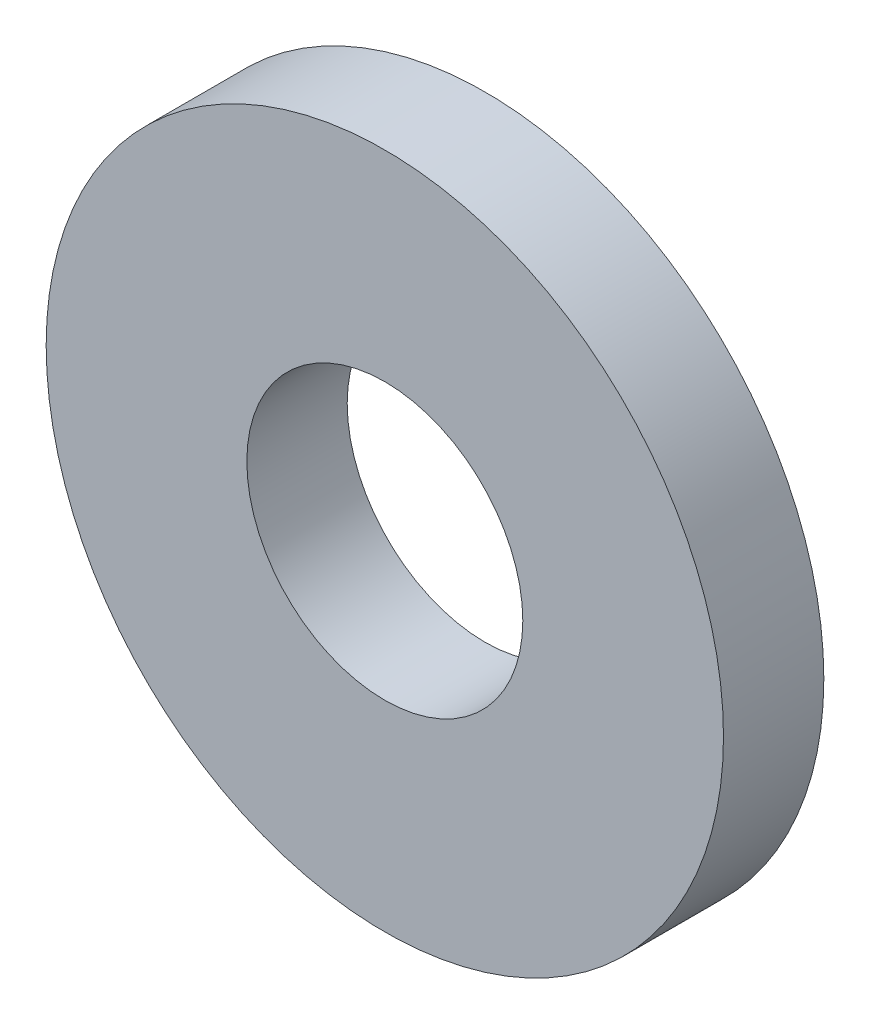
ISO-10303-21;
HEADER;
FILE_DESCRIPTION(('STEP AP214'),'2;1');
FILE_NAME('part.step','',(''),(''),'','','');
FILE_SCHEMA(('AUTOMOTIVE_DESIGN { 1 0 10303 214 1 1 1 1 }'));
ENDSEC;
DATA;
#1=APPLICATION_CONTEXT('core data for automotive mechanical design processes');
#2=APPLICATION_PROTOCOL_DEFINITION('international standard','automotive_design',2000,#1);
#3=PRODUCT_CONTEXT('',#1,'mechanical');
#4=PRODUCT('Part','Part','',(#3));
#5=PRODUCT_RELATED_PRODUCT_CATEGORY('part','',(#4));
#6=PRODUCT_DEFINITION_FORMATION('','',#4);
#7=PRODUCT_DEFINITION_CONTEXT('part definition',#1,'design');
#8=PRODUCT_DEFINITION('design','',#6,#7);
#9=PRODUCT_DEFINITION_SHAPE('','',#8);
#10=(LENGTH_UNIT() NAMED_UNIT(*) SI_UNIT(.MILLI.,.METRE.));
#11=(NAMED_UNIT(*) PLANE_ANGLE_UNIT() SI_UNIT($,.RADIAN.));
#12=(NAMED_UNIT(*) SI_UNIT($,.STERADIAN.) SOLID_ANGLE_UNIT());
#13=UNCERTAINTY_MEASURE_WITH_UNIT(LENGTH_MEASURE(1.E-05),#10,'distance_accuracy_value','');
#14=(GEOMETRIC_REPRESENTATION_CONTEXT(3) GLOBAL_UNCERTAINTY_ASSIGNED_CONTEXT((#13)) GLOBAL_UNIT_ASSIGNED_CONTEXT((#10,
#11,#12)) REPRESENTATION_CONTEXT('',''));
#15=CARTESIAN_POINT('',(0.,0.,0.));
#16=DIRECTION('',(0.,0.,1.));
#17=DIRECTION('',(1.,0.,0.));
#18=AXIS2_PLACEMENT_3D('',#15,#16,#17);
#19=CARTESIAN_POINT('',(0.,0.,3.99999999999997));
#20=DIRECTION('',(0.,0.,1.00000000000003));
#21=DIRECTION('',(0.999999999999999,0.,0.));
#22=AXIS2_PLACEMENT_3D('',#19,#20,#21);
#23=PLANE('',#22);
#24=CARTESIAN_POINT('',(0.,0.,3.99999999999997));
#25=DIRECTION('',(0.,0.,1.00000000000003));
#26=DIRECTION('',(0.999999999999999,0.,0.));
#27=AXIS2_PLACEMENT_3D('',#24,#25,#26);
#28=CIRCLE('',#27,13.5);
#29=CARTESIAN_POINT('',(13.5,0.,3.99999999999997));
#30=VERTEX_POINT('',#29);
#31=EDGE_CURVE('E10',#30,#30,#28,.T.);
#32=ORIENTED_EDGE('',*,*,#31,.T.);
#33=EDGE_LOOP('',(#32));
#34=FACE_BOUND('',#33,.T.);
#35=CARTESIAN_POINT('',(0.,0.,3.99999999999997));
#36=DIRECTION('',(0.,0.,1.00000000000003));
#37=DIRECTION('',(0.999999999999999,0.,0.));
#38=AXIS2_PLACEMENT_3D('',#35,#36,#37);
#39=CIRCLE('',#38,5.5);
#40=CARTESIAN_POINT('',(5.49999999999999,0.,3.99999999999997));
#41=VERTEX_POINT('',#40);
#42=EDGE_CURVE('E41',#41,#41,#39,.T.);
#43=ORIENTED_EDGE('',*,*,#42,.F.);
#44=EDGE_LOOP('',(#43));
#45=FACE_BOUND('',#44,.T.);
#46=ADVANCED_FACE('F30',(#34,#45),#23,.T.);
#47=CARTESIAN_POINT('',(0.,0.,0.));
#48=DIRECTION('',(0.,0.,1.00000000000003));
#49=DIRECTION('',(0.999999999999999,0.,0.));
#50=AXIS2_PLACEMENT_3D('',#47,#48,#49);
#51=PLANE('',#50);
#52=CARTESIAN_POINT('',(0.,0.,0.));
#53=DIRECTION('',(0.,0.,1.00000000000003));
#54=DIRECTION('',(0.999999999999999,0.,0.));
#55=AXIS2_PLACEMENT_3D('',#52,#53,#54);
#56=CIRCLE('',#55,13.5);
#57=CARTESIAN_POINT('',(13.5,0.,0.));
#58=VERTEX_POINT('',#57);
#59=EDGE_CURVE('E34',#58,#58,#56,.T.);
#60=ORIENTED_EDGE('',*,*,#59,.F.);
#61=EDGE_LOOP('',(#60));
#62=FACE_BOUND('',#61,.T.);
#63=CARTESIAN_POINT('',(0.,0.,0.));
#64=DIRECTION('',(0.,0.,1.00000000000003));
#65=DIRECTION('',(0.999999999999999,0.,0.));
#66=AXIS2_PLACEMENT_3D('',#63,#64,#65);
#67=CIRCLE('',#66,5.5);
#68=CARTESIAN_POINT('',(5.49999999999999,0.,0.));
#69=VERTEX_POINT('',#68);
#70=EDGE_CURVE('E43',#69,#69,#67,.T.);
#71=ORIENTED_EDGE('',*,*,#70,.T.);
#72=EDGE_LOOP('',(#71));
#73=FACE_BOUND('',#72,.T.);
#74=ADVANCED_FACE('F53',(#62,#73),#51,.F.);
#75=CARTESIAN_POINT('',(0.,0.,3.99999999999997));
#76=DIRECTION('',(0.,0.,-1.00000000000003));
#77=DIRECTION('',(-0.999999999999999,0.,0.));
#78=AXIS2_PLACEMENT_3D('',#75,#76,#77);
#79=CYLINDRICAL_SURFACE('',#78,13.5);
#80=ORIENTED_EDGE('',*,*,#31,.F.);
#81=EDGE_LOOP('',(#80));
#82=FACE_BOUND('',#81,.T.);
#83=ORIENTED_EDGE('',*,*,#59,.T.);
#84=EDGE_LOOP('',(#83));
#85=FACE_BOUND('',#84,.T.);
#86=ADVANCED_FACE('F32',(#82,#85),#79,.T.);
#87=CARTESIAN_POINT('',(0.,0.,3.99999999999997));
#88=DIRECTION('',(0.,0.,-1.00000000000003));
#89=DIRECTION('',(-0.999999999999999,0.,0.));
#90=AXIS2_PLACEMENT_3D('',#87,#88,#89);
#91=CYLINDRICAL_SURFACE('',#90,5.5);
#92=ORIENTED_EDGE('',*,*,#42,.T.);
#93=EDGE_LOOP('',(#92));
#94=FACE_BOUND('',#93,.T.);
#95=ORIENTED_EDGE('',*,*,#70,.F.);
#96=EDGE_LOOP('',(#95));
#97=FACE_BOUND('',#96,.T.);
#98=ADVANCED_FACE('F49',(#94,#97),#91,.F.);
#99=CLOSED_SHELL('',(#46,#74,#86,#98));
#100=MANIFOLD_SOLID_BREP('B2',#99);
#101=ADVANCED_BREP_SHAPE_REPRESENTATION('',(#18,#100),#14);
#102=SHAPE_DEFINITION_REPRESENTATION(#9,#101);
ENDSEC;
END-ISO-10303-21;
